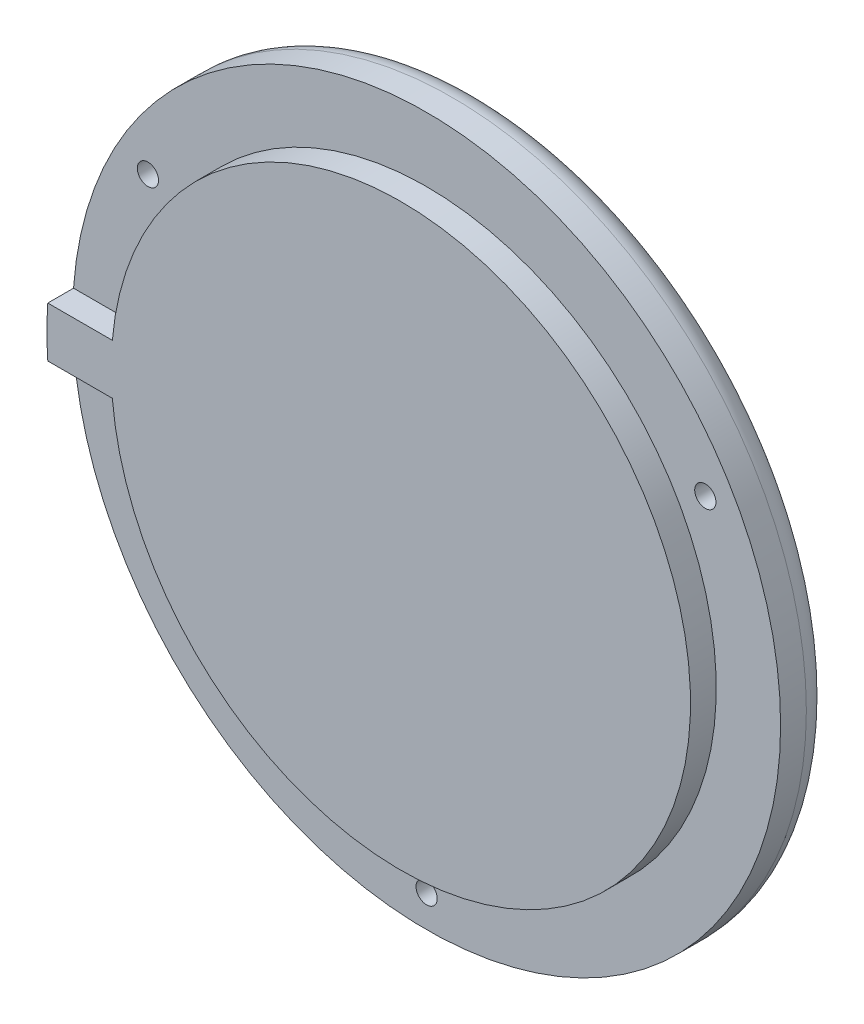
ISO-10303-21;
HEADER;
FILE_DESCRIPTION(('STEP AP214'),'2;1');
FILE_NAME('part.step','',(''),(''),'','','');
FILE_SCHEMA(('AUTOMOTIVE_DESIGN { 1 0 10303 214 1 1 1 1 }'));
ENDSEC;
DATA;
#1=APPLICATION_CONTEXT('core data for automotive mechanical design processes');
#2=APPLICATION_PROTOCOL_DEFINITION('international standard','automotive_design',2000,#1);
#3=PRODUCT_CONTEXT('',#1,'mechanical');
#4=PRODUCT('Part','Part','',(#3));
#5=PRODUCT_RELATED_PRODUCT_CATEGORY('part','',(#4));
#6=PRODUCT_DEFINITION_FORMATION('','',#4);
#7=PRODUCT_DEFINITION_CONTEXT('part definition',#1,'design');
#8=PRODUCT_DEFINITION('design','',#6,#7);
#9=PRODUCT_DEFINITION_SHAPE('','',#8);
#10=(LENGTH_UNIT() NAMED_UNIT(*) SI_UNIT(.MILLI.,.METRE.));
#11=(NAMED_UNIT(*) PLANE_ANGLE_UNIT() SI_UNIT($,.RADIAN.));
#12=(NAMED_UNIT(*) SI_UNIT($,.STERADIAN.) SOLID_ANGLE_UNIT());
#13=UNCERTAINTY_MEASURE_WITH_UNIT(LENGTH_MEASURE(1.E-05),#10,'distance_accuracy_value','');
#14=(GEOMETRIC_REPRESENTATION_CONTEXT(3) GLOBAL_UNCERTAINTY_ASSIGNED_CONTEXT((#13)) GLOBAL_UNIT_ASSIGNED_CONTEXT((#10,
#11,#12)) REPRESENTATION_CONTEXT('',''));
#15=CARTESIAN_POINT('',(0.,0.,0.));
#16=DIRECTION('',(0.,0.,1.));
#17=DIRECTION('',(1.,0.,0.));
#18=AXIS2_PLACEMENT_3D('',#15,#16,#17);
#19=CARTESIAN_POINT('',(0.,0.,8.));
#20=DIRECTION('',(0.,0.,-1.));
#21=DIRECTION('',(-1.,0.,0.));
#22=AXIS2_PLACEMENT_3D('',#19,#20,#21);
#23=CYLINDRICAL_SURFACE('',#22,55.);
#24=CARTESIAN_POINT('',(0.,0.,4.));
#25=DIRECTION('',(0.,0.,1.));
#26=DIRECTION('',(1.,0.,0.));
#27=AXIS2_PLACEMENT_3D('',#24,#25,#26);
#28=CIRCLE('',#27,55.);
#29=CARTESIAN_POINT('',(55.,0.,4.));
#30=VERTEX_POINT('',#29);
#31=EDGE_CURVE('E122',#30,#30,#28,.T.);
#32=ORIENTED_EDGE('',*,*,#31,.T.);
#33=EDGE_LOOP('',(#32));
#34=FACE_BOUND('',#33,.T.);
#35=CARTESIAN_POINT('',(0.,0.,8.));
#36=DIRECTION('',(0.,0.,1.));
#37=DIRECTION('',(1.,0.,0.));
#38=AXIS2_PLACEMENT_3D('',#35,#36,#37);
#39=CIRCLE('',#38,55.);
#40=CARTESIAN_POINT('',(-54.8615530221302,-3.9,8.));
#41=VERTEX_POINT('',#40);
#42=CARTESIAN_POINT('',(-54.8615530221302,3.89999999999999,8.));
#43=VERTEX_POINT('',#42);
#44=EDGE_CURVE('E120',#41,#43,#39,.T.);
#45=ORIENTED_EDGE('',*,*,#44,.F.);
#46=DIRECTION('',(0.,0.,-1.));
#47=VECTOR('',#46,1.);
#48=CARTESIAN_POINT('',(-54.8615530221302,-3.9,12.));
#49=LINE('',#48,#47);
#50=CARTESIAN_POINT('',(-54.8615530221302,-3.9,12.));
#51=VERTEX_POINT('',#50);
#52=EDGE_CURVE('E124',#51,#41,#49,.T.);
#53=ORIENTED_EDGE('',*,*,#52,.F.);
#54=CARTESIAN_POINT('',(0.,0.,12.));
#55=DIRECTION('',(0.,0.,1.));
#56=DIRECTION('',(1.,0.,0.));
#57=AXIS2_PLACEMENT_3D('',#54,#55,#56);
#58=CIRCLE('',#57,55.);
#59=CARTESIAN_POINT('',(-54.8615530221302,3.89999999999999,12.));
#60=VERTEX_POINT('',#59);
#61=EDGE_CURVE('E106',#60,#51,#58,.T.);
#62=ORIENTED_EDGE('',*,*,#61,.F.);
#63=DIRECTION('',(0.,0.,-1.));
#64=VECTOR('',#63,1.);
#65=CARTESIAN_POINT('',(-54.8615530221302,3.89999999999999,12.));
#66=LINE('',#65,#64);
#67=EDGE_CURVE('E103',#60,#43,#66,.T.);
#68=ORIENTED_EDGE('',*,*,#67,.T.);
#69=EDGE_LOOP('',(#45,#53,#62,#68));
#70=FACE_BOUND('',#69,.T.);
#71=ADVANCED_FACE('F32',(#34,#70),#23,.T.);
#72=CARTESIAN_POINT('',(0.,0.,8.));
#73=DIRECTION('',(0.,0.,1.));
#74=DIRECTION('',(1.,0.,0.));
#75=AXIS2_PLACEMENT_3D('',#72,#73,#74);
#76=PLANE('',#75);
#77=CARTESIAN_POINT('',(-43.3012473441129,25.0000000000049,8.));
#78=DIRECTION('',(0.,0.,1.));
#79=DIRECTION('',(1.,0.,0.));
#80=AXIS2_PLACEMENT_3D('',#77,#78,#79);
#81=CIRCLE('',#80,1.64999999999999);
#82=CARTESIAN_POINT('',(-41.6512473441129,25.0000000000049,8.));
#83=VERTEX_POINT('',#82);
#84=EDGE_CURVE('E203',#83,#83,#81,.T.);
#85=ORIENTED_EDGE('',*,*,#84,.F.);
#86=EDGE_LOOP('',(#85));
#87=FACE_BOUND('',#86,.T.);
#88=CARTESIAN_POINT('',(43.3012930343312,25.0000000000058,8.));
#89=DIRECTION('',(0.,0.,1.));
#90=DIRECTION('',(1.,0.,0.));
#91=AXIS2_PLACEMENT_3D('',#88,#89,#90);
#92=CIRCLE('',#91,1.65);
#93=CARTESIAN_POINT('',(44.9512930343312,25.0000000000058,8.));
#94=VERTEX_POINT('',#93);
#95=EDGE_CURVE('E204',#94,#94,#92,.T.);
#96=ORIENTED_EDGE('',*,*,#95,.F.);
#97=EDGE_LOOP('',(#96));
#98=FACE_BOUND('',#97,.T.);
#99=CARTESIAN_POINT('',(2.28451098030686E-05,-49.9999999999948,8.));
#100=DIRECTION('',(0.,0.,1.));
#101=DIRECTION('',(1.,0.,0.));
#102=AXIS2_PLACEMENT_3D('',#99,#100,#101);
#103=CIRCLE('',#102,1.65);
#104=CARTESIAN_POINT('',(1.6500228451098,-49.9999999999948,8.));
#105=VERTEX_POINT('',#104);
#106=EDGE_CURVE('E198',#105,#105,#103,.T.);
#107=ORIENTED_EDGE('',*,*,#106,.F.);
#108=EDGE_LOOP('',(#107));
#109=FACE_BOUND('',#108,.T.);
#110=DIRECTION('',(1.,0.,0.));
#111=VECTOR('',#110,1.);
#112=CARTESIAN_POINT('',(-44.8306814581264,-3.9,8.));
#113=LINE('',#112,#111);
#114=CARTESIAN_POINT('',(-44.8306814581264,-3.9,8.));
#115=VERTEX_POINT('',#114);
#116=EDGE_CURVE('E116',#41,#115,#113,.T.);
#117=ORIENTED_EDGE('',*,*,#116,.F.);
#118=ORIENTED_EDGE('',*,*,#44,.T.);
#119=DIRECTION('',(-1.,0.,0.));
#120=VECTOR('',#119,1.);
#121=CARTESIAN_POINT('',(-44.8306814581264,3.9,8.));
#122=LINE('',#121,#120);
#123=CARTESIAN_POINT('',(-44.8306814581264,3.9,8.));
#124=VERTEX_POINT('',#123);
#125=EDGE_CURVE('E195',#124,#43,#122,.T.);
#126=ORIENTED_EDGE('',*,*,#125,.F.);
#127=CARTESIAN_POINT('',(0.,0.,8.));
#128=DIRECTION('',(0.,0.,1.));
#129=DIRECTION('',(1.,0.,0.));
#130=AXIS2_PLACEMENT_3D('',#127,#128,#129);
#131=CIRCLE('',#130,45.);
#132=EDGE_CURVE('E119',#115,#124,#131,.T.);
#133=ORIENTED_EDGE('',*,*,#132,.F.);
#134=EDGE_LOOP('',(#117,#118,#126,#133));
#135=FACE_BOUND('',#134,.T.);
#136=ADVANCED_FACE('F174',(#87,#98,#109,#135),#76,.T.);
#137=CARTESIAN_POINT('',(0.,0.,0.));
#138=DIRECTION('',(0.,0.,1.));
#139=DIRECTION('',(1.,0.,0.));
#140=AXIS2_PLACEMENT_3D('',#137,#138,#139);
#141=PLANE('',#140);
#142=CARTESIAN_POINT('',(2.28451098030686E-05,-49.9999999999948,0.));
#143=DIRECTION('',(0.,0.,1.));
#144=DIRECTION('',(1.,0.,0.));
#145=AXIS2_PLACEMENT_3D('',#142,#143,#144);
#146=CIRCLE('',#145,2.9);
#147=CARTESIAN_POINT('',(-2.74819600803011,-50.9259012556621,0.));
#148=VERTEX_POINT('',#147);
#149=CARTESIAN_POINT('',(2.7482425443412,-50.9258987443273,0.));
#150=VERTEX_POINT('',#149);
#151=EDGE_CURVE('E224',#148,#150,#146,.F.);
#152=ORIENTED_EDGE('',*,*,#151,.F.);
#153=CARTESIAN_POINT('',(0.,0.,0.));
#154=DIRECTION('',(0.,0.,1.));
#155=DIRECTION('',(1.,0.,0.));
#156=AXIS2_PLACEMENT_3D('',#153,#154,#155);
#157=CIRCLE('',#156,51.);
#158=CARTESIAN_POINT('',(-45.4772243981042,23.0829387436798,0.));
#159=VERTEX_POINT('',#158);
#160=EDGE_CURVE('E134',#148,#159,#157,.F.);
#161=ORIENTED_EDGE('',*,*,#160,.T.);
#162=CARTESIAN_POINT('',(-43.3012473441129,25.0000000000049,0.));
#163=DIRECTION('',(0.,0.,1.));
#164=DIRECTION('',(1.,0.,0.));
#165=AXIS2_PLACEMENT_3D('',#162,#163,#164);
#166=CIRCLE('',#165,2.9);
#167=CARTESIAN_POINT('',(-42.7290108235544,27.8429817735201,0.));
#168=VERTEX_POINT('',#167);
#169=EDGE_CURVE('E212',#168,#159,#166,.F.);
#170=ORIENTED_EDGE('',*,*,#169,.F.);
#171=CARTESIAN_POINT('',(0.,0.,0.));
#172=DIRECTION('',(0.,0.,1.));
#173=DIRECTION('',(1.,0.,0.));
#174=AXIS2_PLACEMENT_3D('',#171,#172,#173);
#175=CIRCLE('',#174,51.);
#176=CARTESIAN_POINT('',(42.7290161215109,27.8429736430515,0.));
#177=VERTEX_POINT('',#176);
#178=EDGE_CURVE('E132',#168,#177,#175,.F.);
#179=ORIENTED_EDGE('',*,*,#178,.T.);
#180=CARTESIAN_POINT('',(43.3012930343312,25.0000000000058,0.));
#181=DIRECTION('',(0.,0.,1.));
#182=DIRECTION('',(1.,0.,0.));
#183=AXIS2_PLACEMENT_3D('',#180,#181,#182);
#184=CIRCLE('',#183,2.9);
#185=CARTESIAN_POINT('',(45.4772410991647,23.0829058397864,0.));
#186=VERTEX_POINT('',#185);
#187=EDGE_CURVE('E223',#186,#177,#184,.F.);
#188=ORIENTED_EDGE('',*,*,#187,.F.);
#189=CARTESIAN_POINT('',(0.,0.,0.));
#190=DIRECTION('',(0.,0.,1.));
#191=DIRECTION('',(1.,0.,0.));
#192=AXIS2_PLACEMENT_3D('',#189,#190,#191);
#193=CIRCLE('',#192,51.);
#194=EDGE_CURVE('E130',#186,#150,#193,.F.);
#195=ORIENTED_EDGE('',*,*,#194,.T.);
#196=EDGE_LOOP('',(#152,#161,#170,#179,#188,#195));
#197=FACE_BOUND('',#196,.T.);
#198=ADVANCED_FACE('F173',(#197),#141,.F.);
#199=CARTESIAN_POINT('',(0.,0.,12.));
#200=DIRECTION('',(0.,0.,-1.));
#201=DIRECTION('',(-1.,0.,0.));
#202=AXIS2_PLACEMENT_3D('',#199,#200,#201);
#203=CYLINDRICAL_SURFACE('',#202,45.);
#204=ORIENTED_EDGE('',*,*,#132,.T.);
#205=DIRECTION('',(0.,0.,-1.));
#206=VECTOR('',#205,1.);
#207=CARTESIAN_POINT('',(-44.8306814581264,3.9,12.));
#208=LINE('',#207,#206);
#209=CARTESIAN_POINT('',(-44.8306814581264,3.9,12.));
#210=VERTEX_POINT('',#209);
#211=EDGE_CURVE('E100',#210,#124,#208,.T.);
#212=ORIENTED_EDGE('',*,*,#211,.F.);
#213=CARTESIAN_POINT('',(0.,0.,12.));
#214=DIRECTION('',(0.,0.,1.));
#215=DIRECTION('',(1.,0.,0.));
#216=AXIS2_PLACEMENT_3D('',#213,#214,#215);
#217=CIRCLE('',#216,45.);
#218=CARTESIAN_POINT('',(-44.8306814581264,-3.9,12.));
#219=VERTEX_POINT('',#218);
#220=EDGE_CURVE('E107',#219,#210,#217,.T.);
#221=ORIENTED_EDGE('',*,*,#220,.F.);
#222=DIRECTION('',(0.,0.,-1.));
#223=VECTOR('',#222,1.);
#224=CARTESIAN_POINT('',(-44.8306814581264,-3.9,12.));
#225=LINE('',#224,#223);
#226=EDGE_CURVE('E191',#219,#115,#225,.T.);
#227=ORIENTED_EDGE('',*,*,#226,.T.);
#228=EDGE_LOOP('',(#204,#212,#221,#227));
#229=FACE_BOUND('',#228,.T.);
#230=ADVANCED_FACE('F118',(#229),#203,.T.);
#231=CARTESIAN_POINT('',(-44.8306814581264,3.9,12.));
#232=DIRECTION('',(0.,-1.,0.));
#233=DIRECTION('',(0.,0.,-1.));
#234=AXIS2_PLACEMENT_3D('',#231,#232,#233);
#235=PLANE('',#234);
#236=ORIENTED_EDGE('',*,*,#125,.T.);
#237=ORIENTED_EDGE('',*,*,#67,.F.);
#238=DIRECTION('',(-1.,0.,0.));
#239=VECTOR('',#238,1.);
#240=CARTESIAN_POINT('',(-44.8306814581264,3.9,12.));
#241=LINE('',#240,#239);
#242=EDGE_CURVE('E95',#210,#60,#241,.T.);
#243=ORIENTED_EDGE('',*,*,#242,.F.);
#244=ORIENTED_EDGE('',*,*,#211,.T.);
#245=EDGE_LOOP('',(#236,#237,#243,#244));
#246=FACE_BOUND('',#245,.T.);
#247=ADVANCED_FACE('F98',(#246),#235,.F.);
#248=CARTESIAN_POINT('',(-44.8306814581264,-3.9,12.));
#249=DIRECTION('',(0.,1.,0.));
#250=DIRECTION('',(-1.,0.,0.));
#251=AXIS2_PLACEMENT_3D('',#248,#249,#250);
#252=PLANE('',#251);
#253=ORIENTED_EDGE('',*,*,#116,.T.);
#254=ORIENTED_EDGE('',*,*,#226,.F.);
#255=DIRECTION('',(1.,0.,0.));
#256=VECTOR('',#255,1.);
#257=CARTESIAN_POINT('',(-44.8306814581264,-3.9,12.));
#258=LINE('',#257,#256);
#259=EDGE_CURVE('E112',#51,#219,#258,.T.);
#260=ORIENTED_EDGE('',*,*,#259,.F.);
#261=ORIENTED_EDGE('',*,*,#52,.T.);
#262=EDGE_LOOP('',(#253,#254,#260,#261));
#263=FACE_BOUND('',#262,.T.);
#264=ADVANCED_FACE('F165',(#263),#252,.F.);
#265=CARTESIAN_POINT('',(0.,0.,12.));
#266=DIRECTION('',(0.,0.,1.));
#267=DIRECTION('',(1.,0.,0.));
#268=AXIS2_PLACEMENT_3D('',#265,#266,#267);
#269=PLANE('',#268);
#270=ORIENTED_EDGE('',*,*,#220,.T.);
#271=ORIENTED_EDGE('',*,*,#242,.T.);
#272=ORIENTED_EDGE('',*,*,#61,.T.);
#273=ORIENTED_EDGE('',*,*,#259,.T.);
#274=EDGE_LOOP('',(#270,#271,#272,#273));
#275=FACE_BOUND('',#274,.T.);
#276=ADVANCED_FACE('F110',(#275),#269,.T.);
#277=CARTESIAN_POINT('',(2.28451098030686E-05,-49.9999999999948,5.));
#278=DIRECTION('',(0.,0.,1.));
#279=DIRECTION('',(1.,0.,0.));
#280=AXIS2_PLACEMENT_3D('',#277,#278,#279);
#281=CYLINDRICAL_SURFACE('',#280,1.65);
#282=CARTESIAN_POINT('',(2.28451098030686E-05,-49.9999999999948,5.));
#283=DIRECTION('',(0.,0.,1.));
#284=DIRECTION('',(1.,0.,0.));
#285=AXIS2_PLACEMENT_3D('',#282,#283,#284);
#286=CIRCLE('',#285,1.65);
#287=CARTESIAN_POINT('',(1.6500228451098,-49.9999999999948,5.));
#288=VERTEX_POINT('',#287);
#289=EDGE_CURVE('E217',#288,#288,#286,.F.);
#290=ORIENTED_EDGE('',*,*,#289,.T.);
#291=EDGE_LOOP('',(#290));
#292=FACE_BOUND('',#291,.T.);
#293=ORIENTED_EDGE('',*,*,#106,.T.);
#294=EDGE_LOOP('',(#293));
#295=FACE_BOUND('',#294,.T.);
#296=ADVANCED_FACE('F158',(#292,#295),#281,.F.);
#297=CARTESIAN_POINT('',(43.3012930343312,25.0000000000058,5.));
#298=DIRECTION('',(0.,0.,1.));
#299=DIRECTION('',(1.,0.,0.));
#300=AXIS2_PLACEMENT_3D('',#297,#298,#299);
#301=CYLINDRICAL_SURFACE('',#300,1.65);
#302=CARTESIAN_POINT('',(43.3012930343312,25.0000000000058,5.));
#303=DIRECTION('',(0.,0.,1.));
#304=DIRECTION('',(1.,0.,0.));
#305=AXIS2_PLACEMENT_3D('',#302,#303,#304);
#306=CIRCLE('',#305,1.65);
#307=CARTESIAN_POINT('',(44.9512930343312,25.0000000000058,5.));
#308=VERTEX_POINT('',#307);
#309=EDGE_CURVE('E220',#308,#308,#306,.F.);
#310=ORIENTED_EDGE('',*,*,#309,.T.);
#311=EDGE_LOOP('',(#310));
#312=FACE_BOUND('',#311,.T.);
#313=ORIENTED_EDGE('',*,*,#95,.T.);
#314=EDGE_LOOP('',(#313));
#315=FACE_BOUND('',#314,.T.);
#316=ADVANCED_FACE('F154',(#312,#315),#301,.F.);
#317=CARTESIAN_POINT('',(-43.3012473441129,25.0000000000049,5.));
#318=DIRECTION('',(0.,0.,1.));
#319=DIRECTION('',(1.,0.,0.));
#320=AXIS2_PLACEMENT_3D('',#317,#318,#319);
#321=CYLINDRICAL_SURFACE('',#320,1.64999999999999);
#322=CARTESIAN_POINT('',(-43.3012473441129,25.0000000000049,5.));
#323=DIRECTION('',(0.,0.,1.));
#324=DIRECTION('',(1.,0.,0.));
#325=AXIS2_PLACEMENT_3D('',#322,#323,#324);
#326=CIRCLE('',#325,1.64999999999999);
#327=CARTESIAN_POINT('',(-41.6512473441129,25.0000000000049,5.));
#328=VERTEX_POINT('',#327);
#329=EDGE_CURVE('E207',#328,#328,#326,.F.);
#330=ORIENTED_EDGE('',*,*,#329,.T.);
#331=EDGE_LOOP('',(#330));
#332=FACE_BOUND('',#331,.T.);
#333=ORIENTED_EDGE('',*,*,#84,.T.);
#334=EDGE_LOOP('',(#333));
#335=FACE_BOUND('',#334,.T.);
#336=ADVANCED_FACE('F151',(#332,#335),#321,.F.);
#337=CARTESIAN_POINT('',(-43.3012473441129,25.0000000000049,5.));
#338=DIRECTION('',(0.,0.,1.));
#339=DIRECTION('',(1.,0.,0.));
#340=AXIS2_PLACEMENT_3D('',#337,#338,#339);
#341=PLANE('',#340);
#342=CARTESIAN_POINT('',(-43.3012473441129,25.0000000000049,5.));
#343=DIRECTION('',(0.,0.,1.));
#344=DIRECTION('',(1.,0.,0.));
#345=AXIS2_PLACEMENT_3D('',#342,#343,#344);
#346=CIRCLE('',#345,2.9);
#347=CARTESIAN_POINT('',(-40.4012473441129,25.0000000000049,5.));
#348=VERTEX_POINT('',#347);
#349=EDGE_CURVE('E214',#348,#348,#346,.T.);
#350=ORIENTED_EDGE('',*,*,#349,.F.);
#351=EDGE_LOOP('',(#350));
#352=FACE_BOUND('',#351,.T.);
#353=ORIENTED_EDGE('',*,*,#329,.F.);
#354=EDGE_LOOP('',(#353));
#355=FACE_BOUND('',#354,.T.);
#356=ADVANCED_FACE('F150',(#352,#355),#341,.F.);
#357=CARTESIAN_POINT('',(-43.3012473441129,25.0000000000049,-8.20243866176395));
#358=DIRECTION('',(0.,0.,1.));
#359=DIRECTION('',(1.,0.,0.));
#360=AXIS2_PLACEMENT_3D('',#357,#358,#359);
#361=CYLINDRICAL_SURFACE('',#360,2.9);
#362=ORIENTED_EDGE('',*,*,#169,.T.);
#363=CARTESIAN_POINT('',(-45.4772243981042,23.0829387436798,0.));
#364=CARTESIAN_POINT('',(-45.5284396029424,23.1410507287034,-1.10050507393734E-05));
#365=CARTESIAN_POINT('',(-45.5772879886309,23.2012106585418,0.00194196620135595));
#366=CARTESIAN_POINT('',(-45.6698960846462,23.3250506413509,0.00931899123834158));
#367=CARTESIAN_POINT('',(-45.7136601411051,23.3887276181774,0.0147400542827468));
#368=CARTESIAN_POINT('',(-45.7956136039169,23.5187783390049,0.028560798131936));
#369=CARTESIAN_POINT('',(-45.8338316338511,23.585135798403,0.0369443573362717));
#370=CARTESIAN_POINT('',(-45.9047794763421,23.7203683113971,0.056191195066171));
#371=CARTESIAN_POINT('',(-45.9375081979352,23.7892438621419,0.0670549655066081));
#372=CARTESIAN_POINT('',(-46.0270464864616,23.9985217308036,0.102521519722634));
#373=CARTESIAN_POINT('',(-46.075527443229,24.142085264828,0.130060912745254));
#374=CARTESIAN_POINT('',(-46.1495701402531,24.4344201194724,0.18877605761616));
#375=CARTESIAN_POINT('',(-46.1750916484868,24.5832001089446,0.219958084907891));
#376=CARTESIAN_POINT('',(-46.2039482304545,24.8955723324395,0.284252418992024));
#377=CARTESIAN_POINT('',(-46.2052654201062,25.0593688157362,0.317310053215754));
#378=CARTESIAN_POINT('',(-46.1801099516534,25.3859299840915,0.377298763728859));
#379=CARTESIAN_POINT('',(-46.1536521726088,25.5486951746453,0.404233110866337));
#380=CARTESIAN_POINT('',(-46.073358050478,25.867224433572,0.446912744673107));
#381=CARTESIAN_POINT('',(-46.0197964773826,26.0230420130586,0.462766594333493));
#382=CARTESIAN_POINT('',(-45.8866351535786,26.3239247499307,0.480489028169366));
#383=CARTESIAN_POINT('',(-45.8070571074612,26.4689987469771,0.482369239115274));
#384=CARTESIAN_POINT('',(-45.634052029289,26.7291383833177,0.472339349761924));
#385=CARTESIAN_POINT('',(-45.5428563210427,26.8457553851141,0.461812194697511));
#386=CARTESIAN_POINT('',(-45.3445876254443,27.063107603179,0.43099444754784));
#387=CARTESIAN_POINT('',(-45.237509497954,27.1638376559855,0.410700689838208));
#388=CARTESIAN_POINT('',(-45.0078782575194,27.3494029845932,0.362901158237171));
#389=CARTESIAN_POINT('',(-44.8850379471904,27.4338425105501,0.33524737888516));
#390=CARTESIAN_POINT('',(-44.6283986311121,27.5827716211207,0.276818005465379));
#391=CARTESIAN_POINT('',(-44.4945902867001,27.6472439769144,0.246039745648753));
#392=CARTESIAN_POINT('',(-44.2038949449543,27.7608119460007,0.182208739553752));
#393=CARTESIAN_POINT('',(-44.046063183237,27.8075637231928,0.149259186976542));
#394=CARTESIAN_POINT('',(-43.7237317043014,27.873757470523,0.0900382505625003));
#395=CARTESIAN_POINT('',(-43.5592451077386,27.8932507189611,0.0637544038041573));
#396=CARTESIAN_POINT('',(-43.2828744687069,27.9020574481257,0.0299099659707146));
#397=CARTESIAN_POINT('',(-43.1716148163683,27.8992291837169,0.0190313224409324));
#398=CARTESIAN_POINT('',(-42.9495284387061,27.8807622557823,0.00405307268271075));
#399=CARTESIAN_POINT('',(-42.8387027835591,27.8651016234002,-3.48715915075799E-05));
#400=CARTESIAN_POINT('',(-42.7290108235544,27.8429817735201,0.));
#401=B_SPLINE_CURVE_WITH_KNOTS('',3,(#363,#364,#365,#366,#367,#368,#369,#370,#371,#372,#373,
#374,#375,#376,#377,#378,#379,#380,#381,#382,#383,#384,#385,#386,#387,#388,#389,#390,#391,#392,
#393,#394,#395,#396,#397,#398,#399,#400),.UNSPECIFIED.,.F.,.F.,(4,2,2,2,2,2,2,2,2,2,2,2,2,2,2,2,
2,2,4),(0.,0.232249396454625,0.464298780012672,0.695104343397284,0.925955723635959,
1.38586620450114,1.84658102915831,2.34554551230159,2.84424283633951,3.33798287771039,
3.83131205648497,4.27447269709832,4.71777707509692,5.17077547600839,5.624163667871,
6.12544681594026,6.62578568388003,6.96038341992898,7.29555518296399),.UNSPECIFIED.);
#402=EDGE_CURVE('E51',#159,#168,#401,.T.);
#403=ORIENTED_EDGE('',*,*,#402,.T.);
#404=EDGE_LOOP('',(#362,#403));
#405=FACE_BOUND('',#404,.T.);
#406=ORIENTED_EDGE('',*,*,#349,.T.);
#407=EDGE_LOOP('',(#406));
#408=FACE_BOUND('',#407,.T.);
#409=ADVANCED_FACE('F144',(#405,#408),#361,.F.);
#410=CARTESIAN_POINT('',(43.3012930343312,25.0000000000058,5.));
#411=DIRECTION('',(0.,0.,1.));
#412=DIRECTION('',(1.,0.,0.));
#413=AXIS2_PLACEMENT_3D('',#410,#411,#412);
#414=PLANE('',#413);
#415=CARTESIAN_POINT('',(43.3012930343312,25.0000000000058,5.));
#416=DIRECTION('',(0.,0.,1.));
#417=DIRECTION('',(1.,0.,0.));
#418=AXIS2_PLACEMENT_3D('',#415,#416,#417);
#419=CIRCLE('',#418,2.9);
#420=CARTESIAN_POINT('',(46.2012930343312,25.0000000000058,5.));
#421=VERTEX_POINT('',#420);
#422=EDGE_CURVE('E227',#421,#421,#419,.T.);
#423=ORIENTED_EDGE('',*,*,#422,.F.);
#424=EDGE_LOOP('',(#423));
#425=FACE_BOUND('',#424,.T.);
#426=ORIENTED_EDGE('',*,*,#309,.F.);
#427=EDGE_LOOP('',(#426));
#428=FACE_BOUND('',#427,.T.);
#429=ADVANCED_FACE('F149',(#425,#428),#414,.F.);
#430=CARTESIAN_POINT('',(43.3012930343312,25.0000000000058,-8.20243866176395));
#431=DIRECTION('',(0.,0.,1.));
#432=DIRECTION('',(1.,0.,0.));
#433=AXIS2_PLACEMENT_3D('',#430,#431,#432);
#434=CYLINDRICAL_SURFACE('',#433,2.9);
#435=ORIENTED_EDGE('',*,*,#187,.T.);
#436=CARTESIAN_POINT('',(42.7290161215109,27.8429736430515,0.));
#437=CARTESIAN_POINT('',(42.8049497533727,27.8582723921239,-1.10054055448986E-05));
#438=CARTESIAN_POINT('',(42.8814735900624,27.8704974678472,0.00194197814572495));
#439=CARTESIAN_POINT('',(43.0350255258301,27.8887806756074,0.00931906422711487));
#440=CARTESIAN_POINT('',(43.1120531338796,27.8948441095756,0.014740175966303));
#441=CARTESIAN_POINT('',(43.2656565665949,27.9007948315861,0.0285610632561232));
#442=CARTESIAN_POINT('',(43.3422325997298,27.9007150514886,0.0369447164692272));
#443=CARTESIAN_POINT('',(43.4948209397525,27.8945437872193,0.0561917969840092));
#444=CARTESIAN_POINT('',(43.570833131718,27.8884511096738,0.0670557162126211));
#445=CARTESIAN_POINT('',(43.7968419068085,27.8613582180093,0.1025228085301));
#446=CARTESIAN_POINT('',(43.9454119985721,27.8315646467384,0.130062683621645));
#447=CARTESIAN_POINT('',(44.2356029894394,27.7495250663374,0.188779087981875));
#448=CARTESIAN_POINT('',(44.3772112802575,27.6972398800148,0.21996189335853));
#449=CARTESIAN_POINT('',(44.662163190648,27.5660494716439,0.28425826218806));
#450=CARTESIAN_POINT('',(44.8046747601842,27.4852945320892,0.317317179290274));
#451=CARTESIAN_POINT('',(45.0749098899622,27.3002336851679,0.377308779381349));
#452=CARTESIAN_POINT('',(45.2026413261906,27.1959404090689,0.40424473260399));
#453=CARTESIAN_POINT('',(45.4383529257039,26.9671429051567,0.446927831658289));
#454=CARTESIAN_POINT('',(45.5465167091023,26.8428497658462,0.462783478886804));
#455=CARTESIAN_POINT('',(45.7405134764765,26.5770893263942,0.48050917533471));
#456=CARTESIAN_POINT('',(45.8263649706887,26.4356364058109,0.482390853304608));
#457=CARTESIAN_POINT('',(45.9651547122,26.1557413874372,0.472363169692058));
#458=CARTESIAN_POINT('',(46.0205522799837,26.0184561140218,0.461836891229064));
#459=CARTESIAN_POINT('',(46.1096548782643,25.7380760083866,0.431020394171235));
#460=CARTESIAN_POINT('',(46.1433528669171,25.5949793062684,0.410727009731141));
#461=CARTESIAN_POINT('',(46.1892460341138,25.303332395098,0.362927853960856));
#462=CARTESIAN_POINT('',(46.2009550541486,25.1547313526629,0.335274116093081));
#463=CARTESIAN_POINT('',(46.2016170147598,24.8580134633527,0.276844268206662));
#464=CARTESIAN_POINT('',(46.1905503665162,24.7098971431138,0.246065492059883));
#465=CARTESIAN_POINT('',(46.1435616922696,24.4013649468892,0.182232514497171));
#466=CARTESIAN_POINT('',(46.1051373454698,24.2413027804437,0.149281441283439));
#467=CARTESIAN_POINT('',(46.0013038415655,23.9290581575666,0.0900566323344656));
#468=CARTESIAN_POINT('',(45.9359456466125,23.7768614275471,0.0637704367428886));
#469=CARTESIAN_POINT('',(45.8053846477746,23.5330971764138,0.0299192565648235));
#470=CARTESIAN_POINT('',(45.7472977170655,23.438142356524,0.0190372916802796));
#471=CARTESIAN_POINT('',(45.6202427431249,23.255014754902,0.00405437919499857));
#472=CARTESIAN_POINT('',(45.5512561914187,23.1668538957684,-3.48953288734671E-05));
#473=CARTESIAN_POINT('',(45.4772410991647,23.0829058397864,0.));
#474=B_SPLINE_CURVE_WITH_KNOTS('',3,(#436,#437,#438,#439,#440,#441,#442,#443,#444,#445,#446,
#447,#448,#449,#450,#451,#452,#453,#454,#455,#456,#457,#458,#459,#460,#461,#462,#463,#464,#465,
#466,#467,#468,#469,#470,#471,#472,#473),.UNSPECIFIED.,.F.,.F.,(4,2,2,2,2,2,2,2,2,2,2,2,2,2,2,2,
2,2,4),(0.,0.232248780392936,0.46429754714644,0.695102459679081,0.925953189047709,
1.38586235596355,1.84657588378864,2.34554011899945,2.8442372313296,3.33797982118626,
3.83131148603271,4.27447145356214,4.71777516087507,5.17076956773996,5.62415374732662,
6.12543545275058,6.62577299503803,6.96042224993951,7.2956459989201),.UNSPECIFIED.);
#475=EDGE_CURVE('E45',#177,#186,#474,.T.);
#476=ORIENTED_EDGE('',*,*,#475,.T.);
#477=EDGE_LOOP('',(#435,#476));
#478=FACE_BOUND('',#477,.T.);
#479=ORIENTED_EDGE('',*,*,#422,.T.);
#480=EDGE_LOOP('',(#479));
#481=FACE_BOUND('',#480,.T.);
#482=ADVANCED_FACE('F236',(#478,#481),#434,.F.);
#483=CARTESIAN_POINT('',(2.28451098030686E-05,-49.9999999999948,5.));
#484=DIRECTION('',(0.,0.,1.));
#485=DIRECTION('',(1.,0.,0.));
#486=AXIS2_PLACEMENT_3D('',#483,#484,#485);
#487=PLANE('',#486);
#488=CARTESIAN_POINT('',(2.28451098030686E-05,-49.9999999999948,5.));
#489=DIRECTION('',(0.,0.,1.));
#490=DIRECTION('',(1.,0.,0.));
#491=AXIS2_PLACEMENT_3D('',#488,#489,#490);
#492=CIRCLE('',#491,2.9);
#493=CARTESIAN_POINT('',(2.9000228451098,-49.9999999999948,5.));
#494=VERTEX_POINT('',#493);
#495=EDGE_CURVE('E228',#494,#494,#492,.T.);
#496=ORIENTED_EDGE('',*,*,#495,.F.);
#497=EDGE_LOOP('',(#496));
#498=FACE_BOUND('',#497,.T.);
#499=ORIENTED_EDGE('',*,*,#289,.F.);
#500=EDGE_LOOP('',(#499));
#501=FACE_BOUND('',#500,.T.);
#502=ADVANCED_FACE('F251',(#498,#501),#487,.F.);
#503=CARTESIAN_POINT('',(2.28451098030686E-05,-49.9999999999948,-8.20243866176395));
#504=DIRECTION('',(0.,0.,1.));
#505=DIRECTION('',(1.,0.,0.));
#506=AXIS2_PLACEMENT_3D('',#503,#504,#505);
#507=CYLINDRICAL_SURFACE('',#506,2.9);
#508=ORIENTED_EDGE('',*,*,#151,.T.);
#509=CARTESIAN_POINT('',(2.7482425443412,-50.9258987443273,0.));
#510=CARTESIAN_POINT('',(2.7235243129215,-50.9993085061167,-1.10052281447666E-05));
#511=CARTESIAN_POINT('',(2.69584909908505,-51.0716925412316,0.00194197217368284));
#512=CARTESIAN_POINT('',(2.63490581218392,-51.2138138011077,0.00931902773342277));
#513=CARTESIAN_POINT('',(2.60164257622392,-51.2835532516212,0.0147401151256257));
#514=CARTESIAN_POINT('',(2.52999330116344,-51.419552789223,0.028560930696163));
#515=CARTESIAN_POINT('',(2.49163567720603,-51.4858295227504,0.0369445369055058));
#516=CARTESIAN_POINT('',(2.40999600962369,-51.6148888972504,0.0561914960292824));
#517=CARTESIAN_POINT('',(2.36671298997018,-51.6776708420035,0.06705534086462));
#518=CARTESIAN_POINT('',(2.23024395161038,-51.859853066382,0.102522164134025));
#519=CARTESIAN_POINT('',(2.13015591727567,-51.9736212326072,0.130061798193176));
#520=CARTESIAN_POINT('',(1.91401010229754,-52.1839130126308,0.188777572813164));
#521=CARTESIAN_POINT('',(1.79792469775376,-52.2804061188383,0.21995998914971));
#522=CARTESIAN_POINT('',(1.5418327361266,-52.4615848113001,0.284255340611062));
#523=CARTESIAN_POINT('',(1.40064032569856,-52.5446249736355,0.317313616275936));
#524=CARTESIAN_POINT('',(1.10525394191509,-52.6861228627803,0.377303771579063));
#525=CARTESIAN_POINT('',(0.951066969950455,-52.7445937269998,0.404238921758262));
#526=CARTESIAN_POINT('',(0.635066160625429,-52.8343246241297,0.446920288178731));
#527=CARTESIAN_POINT('',(0.473343343927945,-52.8658492956208,0.462775036614475));
#528=CARTESIAN_POINT('',(0.146190152410307,-52.9009726139761,0.480499101736491));
#529=CARTESIAN_POINT('',(-0.0192370249593711,-52.9045944791741,0.482380046183208));
#530=CARTESIAN_POINT('',(-0.331027608368032,-52.8848401719769,0.472351259681534));
#531=CARTESIAN_POINT('',(-0.477618851741598,-52.8641721550168,0.46182454290992));
#532=CARTESIAN_POINT('',(-0.764986136701686,-52.8011450733249,0.431007420791292));
#533=CARTESIAN_POINT('',(-0.905760276711819,-52.7587789752985,0.41071384970946));
#534=CARTESIAN_POINT('',(-1.18128041265078,-52.652697848965,0.36291450600842));
#535=CARTESIAN_POINT('',(-1.31582731539541,-52.5885363017874,0.335260747388481));
#536=CARTESIAN_POINT('',(-1.57312354738604,-52.440747837136,0.276831136712637));
#537=CARTESIAN_POINT('',(-1.69586262576618,-52.3571042181417,0.246052618718232));
#538=CARTESIAN_POINT('',(-1.93956415934553,-52.1621418602208,0.182220626858329));
#539=CARTESIAN_POINT('',(-2.05896915527729,-52.0488329569172,0.149270313945428));
#540=CARTESIAN_POINT('',(-2.27746243889013,-51.8027855370694,0.0900474412291475));
#541=CARTESIAN_POINT('',(-2.37658857171992,-51.6700840203985,0.0637624200369083));
#542=CARTESIAN_POINT('',(-2.52240758533542,-51.43513817176,0.0299146110811833));
#543=CARTESIAN_POINT('',(-2.57559280141047,-51.3373632156277,0.0190343069371696));
#544=CARTESIAN_POINT('',(-2.67065095366865,-51.1357820083825,0.00405372590977084));
#545=CARTESIAN_POINT('',(-2.71250431976687,-51.0319656946879,-3.48834588878381E-05));
#546=CARTESIAN_POINT('',(-2.74819600803011,-50.9259012556621,0.));
#547=B_SPLINE_CURVE_WITH_KNOTS('',3,(#509,#510,#511,#512,#513,#514,#515,#516,#517,#518,#519,
#520,#521,#522,#523,#524,#525,#526,#527,#528,#529,#530,#531,#532,#533,#534,#535,#536,#537,#538,
#539,#540,#541,#542,#543,#544,#545,#546),.UNSPECIFIED.,.F.,.F.,(4,2,2,2,2,2,2,2,2,2,2,2,2,2,2,2,
2,2,4),(0.,0.232249088425028,0.464298163582001,0.695103401541477,0.925954456345991,
1.38586428023786,1.84657845648085,2.34554281566974,2.84424003386492,3.33798134946184,
3.831311771256,4.27447207529796,4.71777611792446,5.17077252182392,5.62415870755968,
6.12544113436099,6.62577933953058,6.96040283499028,7.2956005909584),.UNSPECIFIED.);
#548=EDGE_CURVE('E11',#150,#148,#547,.T.);
#549=ORIENTED_EDGE('',*,*,#548,.T.);
#550=EDGE_LOOP('',(#508,#549));
#551=FACE_BOUND('',#550,.T.);
#552=ORIENTED_EDGE('',*,*,#495,.T.);
#553=EDGE_LOOP('',(#552));
#554=FACE_BOUND('',#553,.T.);
#555=ADVANCED_FACE('F256',(#551,#554),#507,.F.);
#556=CARTESIAN_POINT('',(0.,0.,4.));
#557=DIRECTION('',(0.,0.,1.));
#558=DIRECTION('',(1.,0.,0.));
#559=AXIS2_PLACEMENT_3D('',#556,#557,#558);
#560=TOROIDAL_SURFACE('',#559,51.,4.);
#561=ORIENTED_EDGE('',*,*,#402,.F.);
#562=ORIENTED_EDGE('',*,*,#160,.F.);
#563=ORIENTED_EDGE('',*,*,#548,.F.);
#564=ORIENTED_EDGE('',*,*,#194,.F.);
#565=ORIENTED_EDGE('',*,*,#475,.F.);
#566=ORIENTED_EDGE('',*,*,#178,.F.);
#567=EDGE_LOOP('',(#561,#562,#563,#564,#565,#566));
#568=FACE_BOUND('',#567,.T.);
#569=ORIENTED_EDGE('',*,*,#31,.F.);
#570=EDGE_LOOP('',(#569));
#571=FACE_BOUND('',#570,.T.);
#572=ADVANCED_FACE('F34',(#568,#571),#560,.T.);
#573=CLOSED_SHELL('',(#71,#136,#198,#230,#247,#264,#276,#296,#316,#336,#356,#409,#429,#482,#502,
#555,#572));
#574=MANIFOLD_SOLID_BREP('B2',#573);
#575=ADVANCED_BREP_SHAPE_REPRESENTATION('',(#18,#574),#14);
#576=SHAPE_DEFINITION_REPRESENTATION(#9,#575);
ENDSEC;
END-ISO-10303-21;
